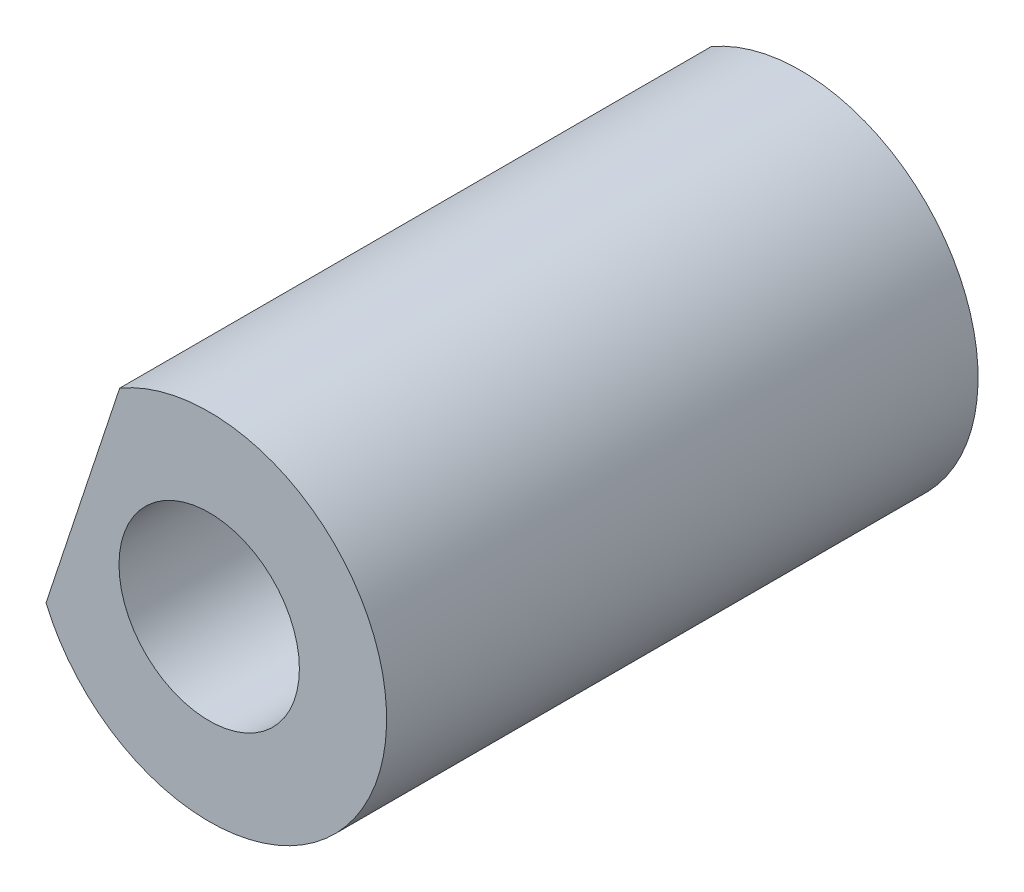
ISO-10303-21;
HEADER;
FILE_DESCRIPTION(('STEP AP214'),'2;1');
FILE_NAME('part.step','',(''),(''),'','','');
FILE_SCHEMA(('AUTOMOTIVE_DESIGN { 1 0 10303 214 1 1 1 1 }'));
ENDSEC;
DATA;
#1=APPLICATION_CONTEXT('core data for automotive mechanical design processes');
#2=APPLICATION_PROTOCOL_DEFINITION('international standard','automotive_design',2000,#1);
#3=PRODUCT_CONTEXT('',#1,'mechanical');
#4=PRODUCT('Part','Part','',(#3));
#5=PRODUCT_RELATED_PRODUCT_CATEGORY('part','',(#4));
#6=PRODUCT_DEFINITION_FORMATION('','',#4);
#7=PRODUCT_DEFINITION_CONTEXT('part definition',#1,'design');
#8=PRODUCT_DEFINITION('design','',#6,#7);
#9=PRODUCT_DEFINITION_SHAPE('','',#8);
#10=(LENGTH_UNIT() NAMED_UNIT(*) SI_UNIT(.MILLI.,.METRE.));
#11=(NAMED_UNIT(*) PLANE_ANGLE_UNIT() SI_UNIT($,.RADIAN.));
#12=(NAMED_UNIT(*) SI_UNIT($,.STERADIAN.) SOLID_ANGLE_UNIT());
#13=UNCERTAINTY_MEASURE_WITH_UNIT(LENGTH_MEASURE(1.E-05),#10,'distance_accuracy_value','');
#14=(GEOMETRIC_REPRESENTATION_CONTEXT(3) GLOBAL_UNCERTAINTY_ASSIGNED_CONTEXT((#13)) GLOBAL_UNIT_ASSIGNED_CONTEXT((#10,
#11,#12)) REPRESENTATION_CONTEXT('',''));
#15=CARTESIAN_POINT('',(0.,0.,0.));
#16=DIRECTION('',(0.,0.,1.));
#17=DIRECTION('',(1.,0.,0.));
#18=AXIS2_PLACEMENT_3D('',#15,#16,#17);
#19=CARTESIAN_POINT('',(0.,0.,20.));
#20=DIRECTION('',(0.,0.,1.));
#21=DIRECTION('',(1.,0.,0.));
#22=AXIS2_PLACEMENT_3D('',#19,#20,#21);
#23=PLANE('',#22);
#24=DIRECTION('',(0.313809119142725,0.949486090863298,0.));
#25=VECTOR('',#24,1.);
#26=CARTESIAN_POINT('',(-5.51807874147624,-2.35601506847217,20.));
#27=LINE('',#26,#25);
#28=CARTESIAN_POINT('',(-5.51807874147624,-2.35601506847217,20.));
#29=VERTEX_POINT('',#28);
#30=CARTESIAN_POINT('',(-3.02729607628567,5.18029714075413,20.));
#31=VERTEX_POINT('',#30);
#32=EDGE_CURVE('E32',#29,#31,#27,.T.);
#33=ORIENTED_EDGE('',*,*,#32,.F.);
#34=CARTESIAN_POINT('',(0.,0.,20.));
#35=DIRECTION('',(0.,0.,1.));
#36=DIRECTION('',(1.,0.,0.));
#37=AXIS2_PLACEMENT_3D('',#34,#35,#36);
#38=CIRCLE('',#37,6.);
#39=EDGE_CURVE('E9',#29,#31,#38,.T.);
#40=ORIENTED_EDGE('',*,*,#39,.T.);
#41=EDGE_LOOP('',(#33,#40));
#42=FACE_BOUND('',#41,.T.);
#43=CARTESIAN_POINT('',(0.,0.,20.));
#44=DIRECTION('',(0.,0.,1.));
#45=DIRECTION('',(1.,0.,0.));
#46=AXIS2_PLACEMENT_3D('',#43,#44,#45);
#47=CIRCLE('',#46,3.05);
#48=CARTESIAN_POINT('',(3.05,0.,20.));
#49=VERTEX_POINT('',#48);
#50=EDGE_CURVE('E55',#49,#49,#47,.T.);
#51=ORIENTED_EDGE('',*,*,#50,.F.);
#52=EDGE_LOOP('',(#51));
#53=FACE_BOUND('',#52,.T.);
#54=ADVANCED_FACE('F15',(#42,#53),#23,.T.);
#55=CARTESIAN_POINT('',(0.,0.,0.));
#56=DIRECTION('',(0.,0.,1.));
#57=DIRECTION('',(1.,0.,0.));
#58=AXIS2_PLACEMENT_3D('',#55,#56,#57);
#59=PLANE('',#58);
#60=CARTESIAN_POINT('',(0.,0.,0.));
#61=DIRECTION('',(0.,0.,1.));
#62=DIRECTION('',(1.,0.,0.));
#63=AXIS2_PLACEMENT_3D('',#60,#61,#62);
#64=CIRCLE('',#63,6.);
#65=CARTESIAN_POINT('',(-5.51807874147625,-2.35601506847217,0.));
#66=VERTEX_POINT('',#65);
#67=CARTESIAN_POINT('',(-3.02729607628567,5.18029714075413,0.));
#68=VERTEX_POINT('',#67);
#69=EDGE_CURVE('E40',#66,#68,#64,.T.);
#70=ORIENTED_EDGE('',*,*,#69,.F.);
#71=DIRECTION('',(0.313809119142725,0.949486090863298,0.));
#72=VECTOR('',#71,1.);
#73=CARTESIAN_POINT('',(-5.51807874147625,-2.35601506847217,0.));
#74=LINE('',#73,#72);
#75=EDGE_CURVE('E25',#66,#68,#74,.T.);
#76=ORIENTED_EDGE('',*,*,#75,.T.);
#77=EDGE_LOOP('',(#70,#76));
#78=FACE_BOUND('',#77,.T.);
#79=CARTESIAN_POINT('',(0.,0.,0.));
#80=DIRECTION('',(0.,0.,1.));
#81=DIRECTION('',(1.,0.,0.));
#82=AXIS2_PLACEMENT_3D('',#79,#80,#81);
#83=CIRCLE('',#82,3.05);
#84=CARTESIAN_POINT('',(3.05,0.,0.));
#85=VERTEX_POINT('',#84);
#86=EDGE_CURVE('E52',#85,#85,#83,.T.);
#87=ORIENTED_EDGE('',*,*,#86,.T.);
#88=EDGE_LOOP('',(#87));
#89=FACE_BOUND('',#88,.T.);
#90=ADVANCED_FACE('F49',(#78,#89),#59,.F.);
#91=CARTESIAN_POINT('',(0.,0.,20.));
#92=DIRECTION('',(0.,0.,-1.));
#93=DIRECTION('',(0.,-1.,0.));
#94=AXIS2_PLACEMENT_3D('',#91,#92,#93);
#95=CYLINDRICAL_SURFACE('',#94,6.);
#96=ORIENTED_EDGE('',*,*,#39,.F.);
#97=DIRECTION('',(0.,0.,-1.));
#98=VECTOR('',#97,1.);
#99=CARTESIAN_POINT('',(-5.51807874147625,-2.35601506847217,20.));
#100=LINE('',#99,#98);
#101=EDGE_CURVE('E47',#29,#66,#100,.T.);
#102=ORIENTED_EDGE('',*,*,#101,.T.);
#103=ORIENTED_EDGE('',*,*,#69,.T.);
#104=DIRECTION('',(0.,0.,1.));
#105=VECTOR('',#104,1.);
#106=CARTESIAN_POINT('',(-3.02729607628567,5.18029714075413,20.));
#107=LINE('',#106,#105);
#108=EDGE_CURVE('E19',#68,#31,#107,.T.);
#109=ORIENTED_EDGE('',*,*,#108,.T.);
#110=EDGE_LOOP('',(#96,#102,#103,#109));
#111=FACE_BOUND('',#110,.T.);
#112=ADVANCED_FACE('F17',(#111),#95,.T.);
#113=CARTESIAN_POINT('',(0.,0.,20.));
#114=DIRECTION('',(0.,0.,-1.));
#115=DIRECTION('',(0.,-1.,0.));
#116=AXIS2_PLACEMENT_3D('',#113,#114,#115);
#117=CYLINDRICAL_SURFACE('',#116,3.05);
#118=ORIENTED_EDGE('',*,*,#50,.T.);
#119=EDGE_LOOP('',(#118));
#120=FACE_BOUND('',#119,.T.);
#121=ORIENTED_EDGE('',*,*,#86,.F.);
#122=EDGE_LOOP('',(#121));
#123=FACE_BOUND('',#122,.T.);
#124=ADVANCED_FACE('F65',(#120,#123),#117,.F.);
#125=CARTESIAN_POINT('',(-6.7396486591559,-6.05209518565428,-21.));
#126=DIRECTION('',(0.949486090863298,-0.313809119142726,0.));
#127=DIRECTION('',(0.313809119142726,0.949486090863298,0.));
#128=AXIS2_PLACEMENT_3D('',#125,#126,#127);
#129=PLANE('',#128);
#130=ORIENTED_EDGE('',*,*,#32,.T.);
#131=ORIENTED_EDGE('',*,*,#108,.F.);
#132=ORIENTED_EDGE('',*,*,#75,.F.);
#133=ORIENTED_EDGE('',*,*,#101,.F.);
#134=EDGE_LOOP('',(#130,#131,#132,#133));
#135=FACE_BOUND('',#134,.T.);
#136=ADVANCED_FACE('F54',(#135),#129,.F.);
#137=CLOSED_SHELL('',(#54,#90,#112,#124,#136));
#138=MANIFOLD_SOLID_BREP('B1',#137);
#139=ADVANCED_BREP_SHAPE_REPRESENTATION('',(#18,#138),#14);
#140=SHAPE_DEFINITION_REPRESENTATION(#9,#139);
ENDSEC;
END-ISO-10303-21;
